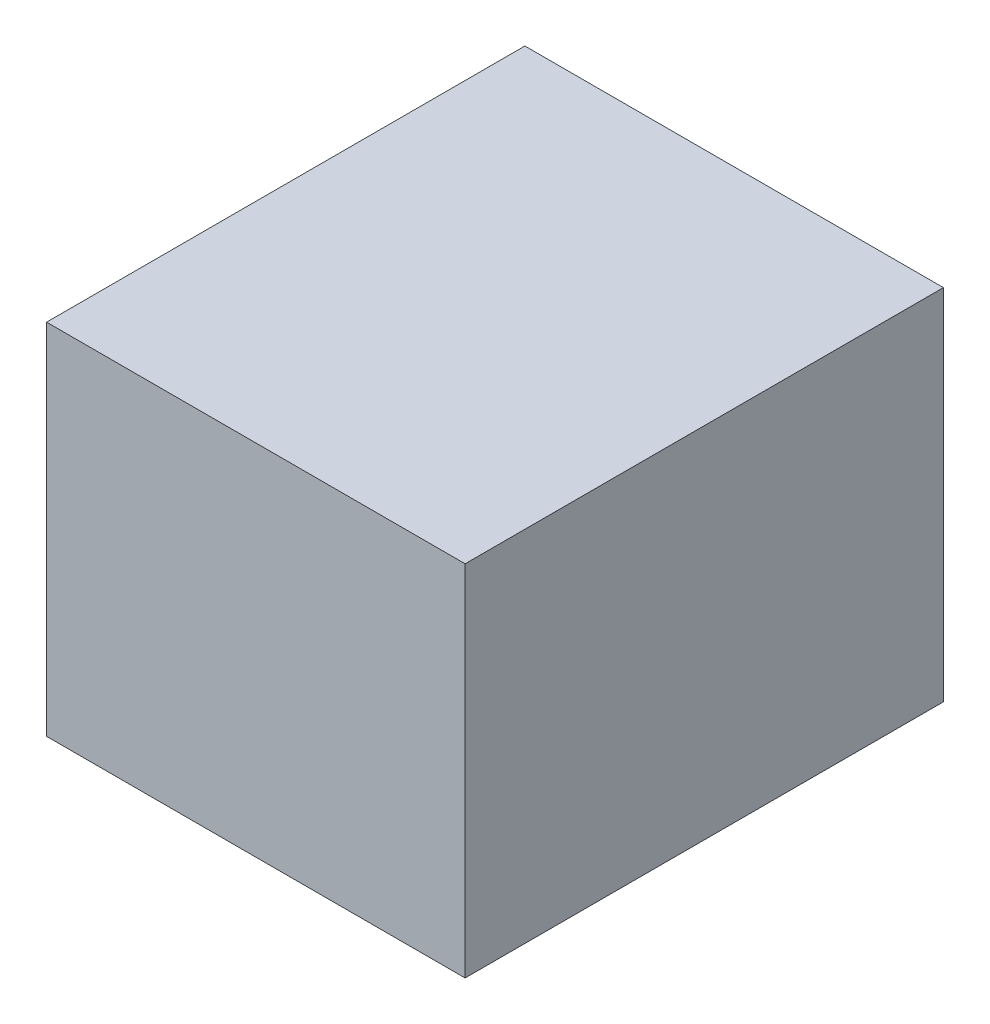
ISO-10303-21;
HEADER;
FILE_DESCRIPTION(('STEP AP214'),'2;1');
FILE_NAME('part.step','',(''),(''),'','','');
FILE_SCHEMA(('AUTOMOTIVE_DESIGN { 1 0 10303 214 1 1 1 1 }'));
ENDSEC;
DATA;
#1=APPLICATION_CONTEXT('core data for automotive mechanical design processes');
#2=APPLICATION_PROTOCOL_DEFINITION('international standard','automotive_design',2000,#1);
#3=PRODUCT_CONTEXT('',#1,'mechanical');
#4=PRODUCT('Part','Part','',(#3));
#5=PRODUCT_RELATED_PRODUCT_CATEGORY('part','',(#4));
#6=PRODUCT_DEFINITION_FORMATION('','',#4);
#7=PRODUCT_DEFINITION_CONTEXT('part definition',#1,'design');
#8=PRODUCT_DEFINITION('design','',#6,#7);
#9=PRODUCT_DEFINITION_SHAPE('','',#8);
#10=(LENGTH_UNIT() NAMED_UNIT(*) SI_UNIT(.MILLI.,.METRE.));
#11=(NAMED_UNIT(*) PLANE_ANGLE_UNIT() SI_UNIT($,.RADIAN.));
#12=(NAMED_UNIT(*) SI_UNIT($,.STERADIAN.) SOLID_ANGLE_UNIT());
#13=UNCERTAINTY_MEASURE_WITH_UNIT(LENGTH_MEASURE(1.E-05),#10,'distance_accuracy_value','');
#14=(GEOMETRIC_REPRESENTATION_CONTEXT(3) GLOBAL_UNCERTAINTY_ASSIGNED_CONTEXT((#13)) GLOBAL_UNIT_ASSIGNED_CONTEXT((#10,
#11,#12)) REPRESENTATION_CONTEXT('',''));
#15=CARTESIAN_POINT('',(0.,0.,0.));
#16=DIRECTION('',(0.,0.,1.));
#17=DIRECTION('',(1.,0.,0.));
#18=AXIS2_PLACEMENT_3D('',#15,#16,#17);
#19=CARTESIAN_POINT('',(110.,-128.,158.));
#20=DIRECTION('',(0.,0.,1.));
#21=DIRECTION('',(1.,0.,0.));
#22=AXIS2_PLACEMENT_3D('',#19,#20,#21);
#23=PLANE('',#22);
#24=DIRECTION('',(0.,1.,0.));
#25=VECTOR('',#24,1.);
#26=CARTESIAN_POINT('',(110.,-128.,158.));
#27=LINE('',#26,#25);
#28=CARTESIAN_POINT('',(110.,-128.,158.));
#29=VERTEX_POINT('',#28);
#30=CARTESIAN_POINT('',(110.,-116.,158.));
#31=VERTEX_POINT('',#30);
#32=EDGE_CURVE('E89',#29,#31,#27,.T.);
#33=ORIENTED_EDGE('',*,*,#32,.F.);
#34=DIRECTION('',(1.,0.,0.));
#35=VECTOR('',#34,1.);
#36=CARTESIAN_POINT('',(110.,-128.,158.));
#37=LINE('',#36,#35);
#38=CARTESIAN_POINT('',(124.,-128.,158.));
#39=VERTEX_POINT('',#38);
#40=EDGE_CURVE('E72',#29,#39,#37,.T.);
#41=ORIENTED_EDGE('',*,*,#40,.T.);
#42=DIRECTION('',(0.,1.,0.));
#43=VECTOR('',#42,1.);
#44=CARTESIAN_POINT('',(124.,-128.,158.));
#45=LINE('',#44,#43);
#46=CARTESIAN_POINT('',(124.,-116.,158.));
#47=VERTEX_POINT('',#46);
#48=EDGE_CURVE('E84',#39,#47,#45,.T.);
#49=ORIENTED_EDGE('',*,*,#48,.T.);
#50=DIRECTION('',(1.,0.,0.));
#51=VECTOR('',#50,1.);
#52=CARTESIAN_POINT('',(110.,-116.,158.));
#53=LINE('',#52,#51);
#54=EDGE_CURVE('E10',#31,#47,#53,.T.);
#55=ORIENTED_EDGE('',*,*,#54,.F.);
#56=EDGE_LOOP('',(#33,#41,#49,#55));
#57=FACE_BOUND('',#56,.T.);
#58=ADVANCED_FACE('F16',(#57),#23,.T.);
#59=CARTESIAN_POINT('',(110.,-128.,142.));
#60=DIRECTION('',(0.,0.,1.));
#61=DIRECTION('',(1.,0.,0.));
#62=AXIS2_PLACEMENT_3D('',#59,#60,#61);
#63=PLANE('',#62);
#64=DIRECTION('',(1.,0.,0.));
#65=VECTOR('',#64,1.);
#66=CARTESIAN_POINT('',(110.,-116.,142.));
#67=LINE('',#66,#65);
#68=CARTESIAN_POINT('',(110.,-116.,142.));
#69=VERTEX_POINT('',#68);
#70=CARTESIAN_POINT('',(124.,-116.,142.));
#71=VERTEX_POINT('',#70);
#72=EDGE_CURVE('E26',#69,#71,#67,.T.);
#73=ORIENTED_EDGE('',*,*,#72,.T.);
#74=DIRECTION('',(0.,1.,0.));
#75=VECTOR('',#74,1.);
#76=CARTESIAN_POINT('',(124.,-128.,142.));
#77=LINE('',#76,#75);
#78=CARTESIAN_POINT('',(124.,-128.,142.));
#79=VERTEX_POINT('',#78);
#80=EDGE_CURVE('E108',#79,#71,#77,.T.);
#81=ORIENTED_EDGE('',*,*,#80,.F.);
#82=DIRECTION('',(1.,0.,0.));
#83=VECTOR('',#82,1.);
#84=CARTESIAN_POINT('',(110.,-128.,142.));
#85=LINE('',#84,#83);
#86=CARTESIAN_POINT('',(110.,-128.,142.));
#87=VERTEX_POINT('',#86);
#88=EDGE_CURVE('E83',#87,#79,#85,.T.);
#89=ORIENTED_EDGE('',*,*,#88,.F.);
#90=DIRECTION('',(0.,1.,0.));
#91=VECTOR('',#90,1.);
#92=CARTESIAN_POINT('',(110.,-128.,142.));
#93=LINE('',#92,#91);
#94=EDGE_CURVE('E90',#87,#69,#93,.T.);
#95=ORIENTED_EDGE('',*,*,#94,.T.);
#96=EDGE_LOOP('',(#73,#81,#89,#95));
#97=FACE_BOUND('',#96,.T.);
#98=ADVANCED_FACE('F130',(#97),#63,.F.);
#99=CARTESIAN_POINT('',(110.,-116.,142.));
#100=DIRECTION('',(0.,1.,0.));
#101=DIRECTION('',(1.,0.,0.));
#102=AXIS2_PLACEMENT_3D('',#99,#100,#101);
#103=PLANE('',#102);
#104=ORIENTED_EDGE('',*,*,#72,.F.);
#105=DIRECTION('',(0.,0.,1.));
#106=VECTOR('',#105,1.);
#107=CARTESIAN_POINT('',(110.,-116.,142.));
#108=LINE('',#107,#106);
#109=EDGE_CURVE('E94',#69,#31,#108,.T.);
#110=ORIENTED_EDGE('',*,*,#109,.T.);
#111=ORIENTED_EDGE('',*,*,#54,.T.);
#112=DIRECTION('',(0.,0.,1.));
#113=VECTOR('',#112,1.);
#114=CARTESIAN_POINT('',(124.,-116.,142.));
#115=LINE('',#114,#113);
#116=EDGE_CURVE('E20',#71,#47,#115,.T.);
#117=ORIENTED_EDGE('',*,*,#116,.F.);
#118=EDGE_LOOP('',(#104,#110,#111,#117));
#119=FACE_BOUND('',#118,.T.);
#120=ADVANCED_FACE('F18',(#119),#103,.T.);
#121=CARTESIAN_POINT('',(110.,-128.,142.));
#122=DIRECTION('',(0.,1.,0.));
#123=DIRECTION('',(1.,0.,0.));
#124=AXIS2_PLACEMENT_3D('',#121,#122,#123);
#125=PLANE('',#124);
#126=DIRECTION('',(0.,0.,1.));
#127=VECTOR('',#126,1.);
#128=CARTESIAN_POINT('',(124.,-128.,142.));
#129=LINE('',#128,#127);
#130=EDGE_CURVE('E78',#79,#39,#129,.T.);
#131=ORIENTED_EDGE('',*,*,#130,.T.);
#132=ORIENTED_EDGE('',*,*,#40,.F.);
#133=DIRECTION('',(0.,0.,1.));
#134=VECTOR('',#133,1.);
#135=CARTESIAN_POINT('',(110.,-128.,142.));
#136=LINE('',#135,#134);
#137=EDGE_CURVE('E75',#87,#29,#136,.T.);
#138=ORIENTED_EDGE('',*,*,#137,.F.);
#139=ORIENTED_EDGE('',*,*,#88,.T.);
#140=EDGE_LOOP('',(#131,#132,#138,#139));
#141=FACE_BOUND('',#140,.T.);
#142=ADVANCED_FACE('F74',(#141),#125,.F.);
#143=CARTESIAN_POINT('',(124.,-128.,142.));
#144=DIRECTION('',(1.,0.,0.));
#145=DIRECTION('',(0.,1.,0.));
#146=AXIS2_PLACEMENT_3D('',#143,#144,#145);
#147=PLANE('',#146);
#148=ORIENTED_EDGE('',*,*,#130,.F.);
#149=ORIENTED_EDGE('',*,*,#80,.T.);
#150=ORIENTED_EDGE('',*,*,#116,.T.);
#151=ORIENTED_EDGE('',*,*,#48,.F.);
#152=EDGE_LOOP('',(#148,#149,#150,#151));
#153=FACE_BOUND('',#152,.T.);
#154=ADVANCED_FACE('F129',(#153),#147,.T.);
#155=CARTESIAN_POINT('',(110.,-128.,142.));
#156=DIRECTION('',(1.,0.,0.));
#157=DIRECTION('',(0.,1.,0.));
#158=AXIS2_PLACEMENT_3D('',#155,#156,#157);
#159=PLANE('',#158);
#160=ORIENTED_EDGE('',*,*,#32,.T.);
#161=ORIENTED_EDGE('',*,*,#109,.F.);
#162=ORIENTED_EDGE('',*,*,#94,.F.);
#163=ORIENTED_EDGE('',*,*,#137,.T.);
#164=EDGE_LOOP('',(#160,#161,#162,#163));
#165=FACE_BOUND('',#164,.T.);
#166=ADVANCED_FACE('F87',(#165),#159,.F.);
#167=CLOSED_SHELL('',(#58,#98,#120,#142,#154,#166));
#168=MANIFOLD_SOLID_BREP('B1',#167);
#169=ADVANCED_BREP_SHAPE_REPRESENTATION('',(#18,#168),#14);
#170=SHAPE_DEFINITION_REPRESENTATION(#9,#169);
ENDSEC;
END-ISO-10303-21;
